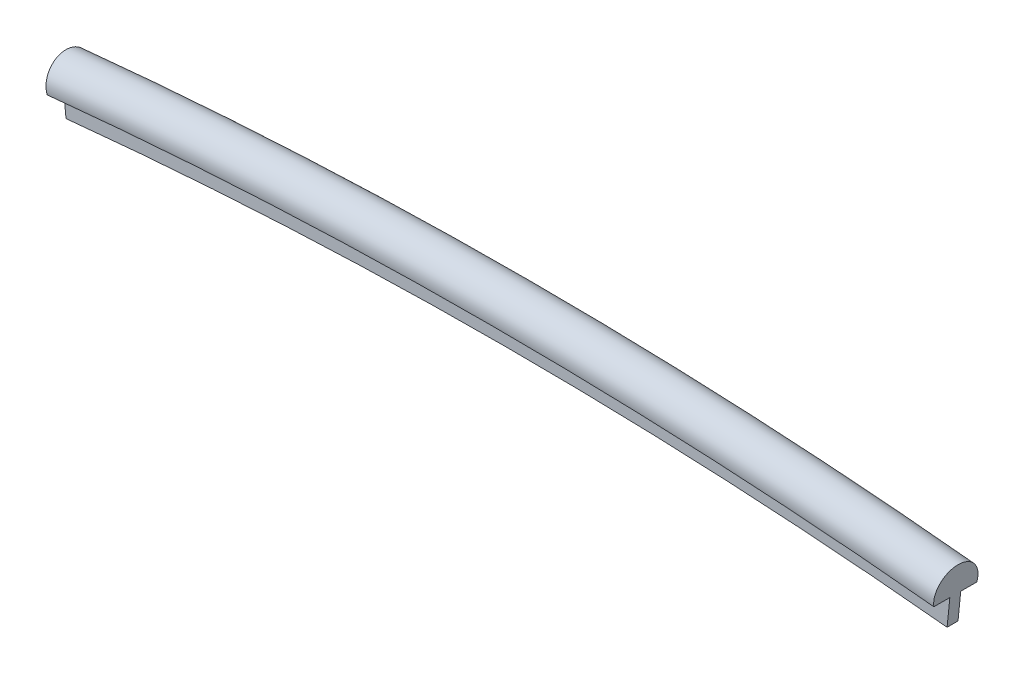
ISO-10303-21;
HEADER;
FILE_DESCRIPTION(('STEP AP214'),'2;1');
FILE_NAME('part.step','',(''),(''),'','','');
FILE_SCHEMA(('AUTOMOTIVE_DESIGN { 1 0 10303 214 1 1 1 1 }'));
ENDSEC;
DATA;
#1=APPLICATION_CONTEXT('core data for automotive mechanical design processes');
#2=APPLICATION_PROTOCOL_DEFINITION('international standard','automotive_design',2000,#1);
#3=PRODUCT_CONTEXT('',#1,'mechanical');
#4=PRODUCT('Part','Part','',(#3));
#5=PRODUCT_RELATED_PRODUCT_CATEGORY('part','',(#4));
#6=PRODUCT_DEFINITION_FORMATION('','',#4);
#7=PRODUCT_DEFINITION_CONTEXT('part definition',#1,'design');
#8=PRODUCT_DEFINITION('design','',#6,#7);
#9=PRODUCT_DEFINITION_SHAPE('','',#8);
#10=(LENGTH_UNIT() NAMED_UNIT(*) SI_UNIT(.MILLI.,.METRE.));
#11=(NAMED_UNIT(*) PLANE_ANGLE_UNIT() SI_UNIT($,.RADIAN.));
#12=(NAMED_UNIT(*) SI_UNIT($,.STERADIAN.) SOLID_ANGLE_UNIT());
#13=UNCERTAINTY_MEASURE_WITH_UNIT(LENGTH_MEASURE(1.E-05),#10,'distance_accuracy_value','');
#14=(GEOMETRIC_REPRESENTATION_CONTEXT(3) GLOBAL_UNCERTAINTY_ASSIGNED_CONTEXT((#13)) GLOBAL_UNIT_ASSIGNED_CONTEXT((#10,
#11,#12)) REPRESENTATION_CONTEXT('',''));
#15=CARTESIAN_POINT('',(0.,0.,0.));
#16=DIRECTION('',(0.,0.,1.));
#17=DIRECTION('',(1.,0.,0.));
#18=AXIS2_PLACEMENT_3D('',#15,#16,#17);
#19=CARTESIAN_POINT('',(0.,0.,70.5976415970385));
#20=DIRECTION('',(0.,0.,1.));
#21=DIRECTION('',(1.,0.,0.));
#22=AXIS2_PLACEMENT_3D('',#19,#20,#21);
#23=CYLINDRICAL_SURFACE('',#22,241.3);
#24=CARTESIAN_POINT('',(0.,0.,1.18));
#25=DIRECTION('',(0.,0.,1.));
#26=DIRECTION('',(1.,0.,0.));
#27=AXIS2_PLACEMENT_3D('',#24,#25,#26);
#28=CIRCLE('',#27,241.3);
#29=CARTESIAN_POINT('',(24.3833321151586,240.064872721858,1.18));
#30=VERTEX_POINT('',#29);
#31=CARTESIAN_POINT('',(-24.3833321151586,240.064872721858,1.18));
#32=VERTEX_POINT('',#31);
#33=EDGE_CURVE('E11',#30,#32,#28,.T.);
#34=ORIENTED_EDGE('',*,*,#33,.T.);
#35=DIRECTION('',(0.,0.,-1.));
#36=VECTOR('',#35,1.);
#37=CARTESIAN_POINT('',(-24.3833321151586,240.064872721858,1.18));
#38=LINE('',#37,#36);
#39=CARTESIAN_POINT('',(-24.3833321151586,240.064872721858,0.3));
#40=VERTEX_POINT('',#39);
#41=EDGE_CURVE('E103',#32,#40,#38,.T.);
#42=ORIENTED_EDGE('',*,*,#41,.T.);
#43=CARTESIAN_POINT('',(0.,0.,0.299999999999995));
#44=DIRECTION('',(0.,0.,1.));
#45=DIRECTION('',(1.,0.,0.));
#46=AXIS2_PLACEMENT_3D('',#43,#44,#45);
#47=CIRCLE('',#46,241.3);
#48=CARTESIAN_POINT('',(24.3833321151586,240.064872721858,0.3));
#49=VERTEX_POINT('',#48);
#50=EDGE_CURVE('E85',#49,#40,#47,.T.);
#51=ORIENTED_EDGE('',*,*,#50,.F.);
#52=DIRECTION('',(0.,0.,-1.));
#53=VECTOR('',#52,1.);
#54=CARTESIAN_POINT('',(24.3833321151586,240.064872721858,1.18));
#55=LINE('',#54,#53);
#56=EDGE_CURVE('E117',#30,#49,#55,.T.);
#57=ORIENTED_EDGE('',*,*,#56,.F.);
#58=EDGE_LOOP('',(#34,#42,#51,#57));
#59=FACE_BOUND('',#58,.T.);
#60=ADVANCED_FACE('F33',(#59),#23,.F.);
#61=CARTESIAN_POINT('',(0.,0.,0.));
#62=DIRECTION('',(0.,0.,1.));
#63=DIRECTION('',(1.,0.,0.));
#64=AXIS2_PLACEMENT_3D('',#61,#62,#63);
#65=TOROIDAL_SURFACE('',#64,241.586013989906,1.21416802890791);
#66=CARTESIAN_POINT('',(0.,0.,-1.18));
#67=DIRECTION('',(0.,0.,1.));
#68=DIRECTION('',(1.,0.,0.));
#69=AXIS2_PLACEMENT_3D('',#66,#67,#68);
#70=CIRCLE('',#69,241.3);
#71=CARTESIAN_POINT('',(24.3833321151586,240.064872721858,-1.18));
#72=VERTEX_POINT('',#71);
#73=CARTESIAN_POINT('',(-24.3833321151586,240.064872721858,-1.18));
#74=VERTEX_POINT('',#73);
#75=EDGE_CURVE('E41',#72,#74,#70,.T.);
#76=ORIENTED_EDGE('',*,*,#75,.T.);
#77=CARTESIAN_POINT('',(-24.4122337898601,240.349422709771,0.));
#78=DIRECTION('',(0.994881362295309,0.101049863718022,0.));
#79=DIRECTION('',(0.,0.,1.));
#80=AXIS2_PLACEMENT_3D('',#77,#78,#79);
#81=CIRCLE('',#80,1.21416802890791);
#82=EDGE_CURVE('E115',#74,#32,#81,.T.);
#83=ORIENTED_EDGE('',*,*,#82,.T.);
#84=ORIENTED_EDGE('',*,*,#33,.F.);
#85=CARTESIAN_POINT('',(24.4122337898601,240.349422709771,0.));
#86=DIRECTION('',(0.994881362295309,-0.101049863718022,0.));
#87=DIRECTION('',(0.,0.,1.));
#88=AXIS2_PLACEMENT_3D('',#85,#86,#87);
#89=CIRCLE('',#88,1.21416802890791);
#90=EDGE_CURVE('E97',#72,#30,#89,.T.);
#91=ORIENTED_EDGE('',*,*,#90,.F.);
#92=EDGE_LOOP('',(#76,#83,#84,#91));
#93=FACE_BOUND('',#92,.T.);
#94=ADVANCED_FACE('F35',(#93),#65,.T.);
#95=CARTESIAN_POINT('',(0.,0.,70.5976415970385));
#96=DIRECTION('',(0.,0.,1.));
#97=DIRECTION('',(1.,0.,0.));
#98=AXIS2_PLACEMENT_3D('',#95,#96,#97);
#99=CYLINDRICAL_SURFACE('',#98,241.3);
#100=CARTESIAN_POINT('',(0.,0.,-0.299999999999995));
#101=DIRECTION('',(0.,0.,1.));
#102=DIRECTION('',(1.,0.,0.));
#103=AXIS2_PLACEMENT_3D('',#100,#101,#102);
#104=CIRCLE('',#103,241.3);
#105=CARTESIAN_POINT('',(24.3833321151586,240.064872721858,-0.3));
#106=VERTEX_POINT('',#105);
#107=CARTESIAN_POINT('',(-24.3833321151586,240.064872721858,-0.3));
#108=VERTEX_POINT('',#107);
#109=EDGE_CURVE('E132',#106,#108,#104,.T.);
#110=ORIENTED_EDGE('',*,*,#109,.T.);
#111=DIRECTION('',(0.,0.,-1.));
#112=VECTOR('',#111,1.);
#113=CARTESIAN_POINT('',(-24.3833321151586,240.064872721858,-0.3));
#114=LINE('',#113,#112);
#115=EDGE_CURVE('E113',#108,#74,#114,.T.);
#116=ORIENTED_EDGE('',*,*,#115,.T.);
#117=ORIENTED_EDGE('',*,*,#75,.F.);
#118=DIRECTION('',(0.,0.,-1.));
#119=VECTOR('',#118,1.);
#120=CARTESIAN_POINT('',(24.3833321151586,240.064872721858,-0.3));
#121=LINE('',#120,#119);
#122=EDGE_CURVE('E125',#106,#72,#121,.T.);
#123=ORIENTED_EDGE('',*,*,#122,.F.);
#124=EDGE_LOOP('',(#110,#116,#117,#123));
#125=FACE_BOUND('',#124,.T.);
#126=ADVANCED_FACE('F134',(#125),#99,.F.);
#127=CARTESIAN_POINT('',(24.2317573195816,238.572550678415,-0.3));
#128=DIRECTION('',(0.,0.,1.));
#129=DIRECTION('',(1.,0.,0.));
#130=AXIS2_PLACEMENT_3D('',#127,#128,#129);
#131=PLANE('',#130);
#132=CARTESIAN_POINT('',(0.,0.,-0.299999999999995));
#133=DIRECTION('',(0.,0.,1.));
#134=DIRECTION('',(1.,0.,0.));
#135=AXIS2_PLACEMENT_3D('',#132,#133,#134);
#136=CIRCLE('',#135,239.8);
#137=CARTESIAN_POINT('',(24.2317573195816,238.572550678415,-0.3));
#138=VERTEX_POINT('',#137);
#139=CARTESIAN_POINT('',(-24.2317573195816,238.572550678415,-0.3));
#140=VERTEX_POINT('',#139);
#141=EDGE_CURVE('E129',#138,#140,#136,.T.);
#142=ORIENTED_EDGE('',*,*,#141,.T.);
#143=DIRECTION('',(-0.101049863718022,0.994881362295309,0.));
#144=VECTOR('',#143,1.);
#145=CARTESIAN_POINT('',(-24.2317573195816,238.572550678415,-0.3));
#146=LINE('',#145,#144);
#147=EDGE_CURVE('E110',#140,#108,#146,.T.);
#148=ORIENTED_EDGE('',*,*,#147,.T.);
#149=ORIENTED_EDGE('',*,*,#109,.F.);
#150=DIRECTION('',(0.101049863718022,0.994881362295309,0.));
#151=VECTOR('',#150,1.);
#152=CARTESIAN_POINT('',(24.2317573195816,238.572550678415,-0.3));
#153=LINE('',#152,#151);
#154=EDGE_CURVE('E122',#138,#106,#153,.T.);
#155=ORIENTED_EDGE('',*,*,#154,.F.);
#156=EDGE_LOOP('',(#142,#148,#149,#155));
#157=FACE_BOUND('',#156,.T.);
#158=ADVANCED_FACE('F136',(#157),#131,.F.);
#159=CARTESIAN_POINT('',(0.,0.,70.5976415970385));
#160=DIRECTION('',(0.,0.,1.));
#161=DIRECTION('',(1.,0.,0.));
#162=AXIS2_PLACEMENT_3D('',#159,#160,#161);
#163=CYLINDRICAL_SURFACE('',#162,239.8);
#164=CARTESIAN_POINT('',(0.,0.,0.299999999999995));
#165=DIRECTION('',(0.,0.,1.));
#166=DIRECTION('',(1.,0.,0.));
#167=AXIS2_PLACEMENT_3D('',#164,#165,#166);
#168=CIRCLE('',#167,239.8);
#169=CARTESIAN_POINT('',(24.2317573195816,238.572550678415,0.3));
#170=VERTEX_POINT('',#169);
#171=CARTESIAN_POINT('',(-24.2317573195816,238.572550678415,0.3));
#172=VERTEX_POINT('',#171);
#173=EDGE_CURVE('E96',#170,#172,#168,.T.);
#174=ORIENTED_EDGE('',*,*,#173,.T.);
#175=DIRECTION('',(0.,0.,-1.));
#176=VECTOR('',#175,1.);
#177=CARTESIAN_POINT('',(-24.2317573195816,238.572550678415,0.));
#178=LINE('',#177,#176);
#179=EDGE_CURVE('E105',#172,#140,#178,.T.);
#180=ORIENTED_EDGE('',*,*,#179,.T.);
#181=ORIENTED_EDGE('',*,*,#141,.F.);
#182=DIRECTION('',(0.,0.,-1.));
#183=VECTOR('',#182,1.);
#184=CARTESIAN_POINT('',(24.2317573195816,238.572550678415,0.));
#185=LINE('',#184,#183);
#186=EDGE_CURVE('E120',#170,#138,#185,.T.);
#187=ORIENTED_EDGE('',*,*,#186,.F.);
#188=EDGE_LOOP('',(#174,#180,#181,#187));
#189=FACE_BOUND('',#188,.T.);
#190=ADVANCED_FACE('F141',(#189),#163,.F.);
#191=CARTESIAN_POINT('',(24.2317573195816,238.572550678415,0.3));
#192=DIRECTION('',(0.,0.,-1.));
#193=DIRECTION('',(-1.,0.,0.));
#194=AXIS2_PLACEMENT_3D('',#191,#192,#193);
#195=PLANE('',#194);
#196=DIRECTION('',(-0.101049863718022,-0.994881362295309,0.));
#197=VECTOR('',#196,1.);
#198=CARTESIAN_POINT('',(24.2317573195816,238.572550678415,0.3));
#199=LINE('',#198,#197);
#200=EDGE_CURVE('E91',#49,#170,#199,.T.);
#201=ORIENTED_EDGE('',*,*,#200,.F.);
#202=ORIENTED_EDGE('',*,*,#50,.T.);
#203=DIRECTION('',(0.101049863718022,-0.994881362295309,0.));
#204=VECTOR('',#203,1.);
#205=CARTESIAN_POINT('',(-24.2317573195816,238.572550678415,0.3));
#206=LINE('',#205,#204);
#207=EDGE_CURVE('E88',#40,#172,#206,.T.);
#208=ORIENTED_EDGE('',*,*,#207,.T.);
#209=ORIENTED_EDGE('',*,*,#173,.F.);
#210=EDGE_LOOP('',(#201,#202,#208,#209));
#211=FACE_BOUND('',#210,.T.);
#212=ADVANCED_FACE('F87',(#211),#195,.F.);
#213=CARTESIAN_POINT('',(24.4122337898601,240.349422709771,0.));
#214=DIRECTION('',(-0.994881362295309,0.101049863718022,0.));
#215=DIRECTION('',(0.,0.,1.));
#216=AXIS2_PLACEMENT_3D('',#213,#214,#215);
#217=PLANE('',#216);
#218=ORIENTED_EDGE('',*,*,#56,.T.);
#219=ORIENTED_EDGE('',*,*,#200,.T.);
#220=ORIENTED_EDGE('',*,*,#186,.T.);
#221=ORIENTED_EDGE('',*,*,#154,.T.);
#222=ORIENTED_EDGE('',*,*,#122,.T.);
#223=ORIENTED_EDGE('',*,*,#90,.T.);
#224=EDGE_LOOP('',(#218,#219,#220,#221,#222,#223));
#225=FACE_BOUND('',#224,.T.);
#226=ADVANCED_FACE('F143',(#225),#217,.F.);
#227=CARTESIAN_POINT('',(-24.4122337898601,240.349422709771,0.));
#228=DIRECTION('',(-0.994881362295309,-0.101049863718022,0.));
#229=DIRECTION('',(0.,0.,1.));
#230=AXIS2_PLACEMENT_3D('',#227,#228,#229);
#231=PLANE('',#230);
#232=ORIENTED_EDGE('',*,*,#41,.F.);
#233=ORIENTED_EDGE('',*,*,#82,.F.);
#234=ORIENTED_EDGE('',*,*,#115,.F.);
#235=ORIENTED_EDGE('',*,*,#147,.F.);
#236=ORIENTED_EDGE('',*,*,#179,.F.);
#237=ORIENTED_EDGE('',*,*,#207,.F.);
#238=EDGE_LOOP('',(#232,#233,#234,#235,#236,#237));
#239=FACE_BOUND('',#238,.T.);
#240=ADVANCED_FACE('F101',(#239),#231,.T.);
#241=CLOSED_SHELL('',(#60,#94,#126,#158,#190,#212,#226,#240));
#242=MANIFOLD_SOLID_BREP('B2',#241);
#243=ADVANCED_BREP_SHAPE_REPRESENTATION('',(#18,#242),#14);
#244=SHAPE_DEFINITION_REPRESENTATION(#9,#243);
ENDSEC;
END-ISO-10303-21;
